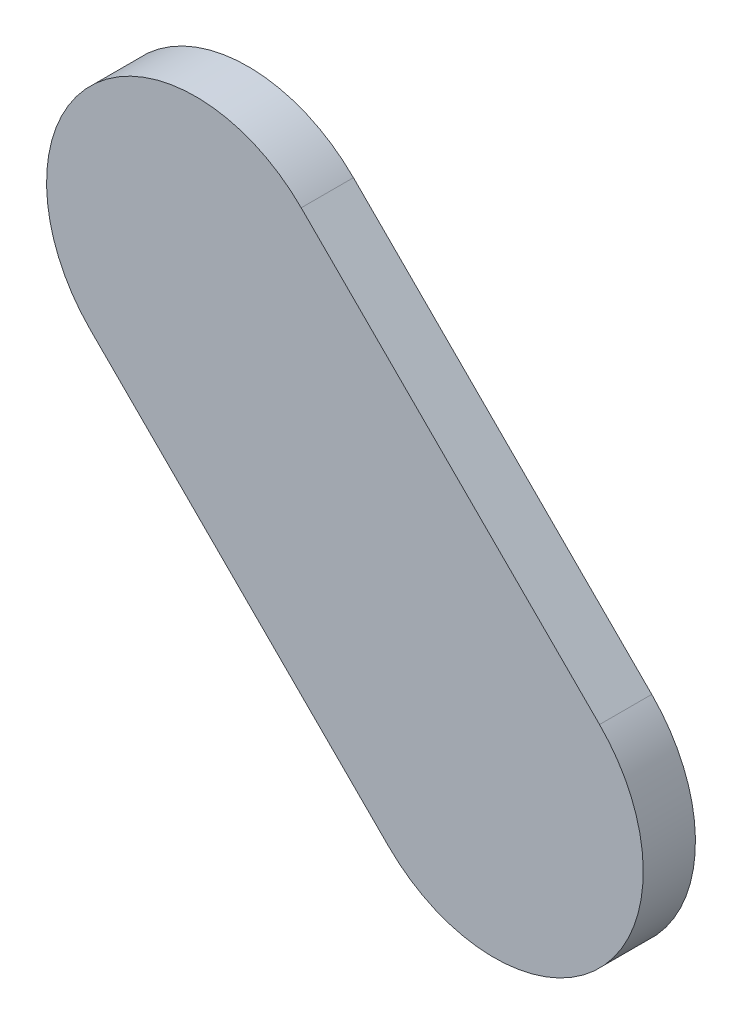
ISO-10303-21;
HEADER;
FILE_DESCRIPTION(('STEP AP214'),'2;1');
FILE_NAME('part.step','',(''),(''),'','','');
FILE_SCHEMA(('AUTOMOTIVE_DESIGN { 1 0 10303 214 1 1 1 1 }'));
ENDSEC;
DATA;
#1=APPLICATION_CONTEXT('core data for automotive mechanical design processes');
#2=APPLICATION_PROTOCOL_DEFINITION('international standard','automotive_design',2000,#1);
#3=PRODUCT_CONTEXT('',#1,'mechanical');
#4=PRODUCT('Part','Part','',(#3));
#5=PRODUCT_RELATED_PRODUCT_CATEGORY('part','',(#4));
#6=PRODUCT_DEFINITION_FORMATION('','',#4);
#7=PRODUCT_DEFINITION_CONTEXT('part definition',#1,'design');
#8=PRODUCT_DEFINITION('design','',#6,#7);
#9=PRODUCT_DEFINITION_SHAPE('','',#8);
#10=(LENGTH_UNIT() NAMED_UNIT(*) SI_UNIT(.MILLI.,.METRE.));
#11=(NAMED_UNIT(*) PLANE_ANGLE_UNIT() SI_UNIT($,.RADIAN.));
#12=(NAMED_UNIT(*) SI_UNIT($,.STERADIAN.) SOLID_ANGLE_UNIT());
#13=UNCERTAINTY_MEASURE_WITH_UNIT(LENGTH_MEASURE(1.E-05),#10,'distance_accuracy_value','');
#14=(GEOMETRIC_REPRESENTATION_CONTEXT(3) GLOBAL_UNCERTAINTY_ASSIGNED_CONTEXT((#13)) GLOBAL_UNIT_ASSIGNED_CONTEXT((#10,
#11,#12)) REPRESENTATION_CONTEXT('',''));
#15=CARTESIAN_POINT('',(0.,0.,0.));
#16=DIRECTION('',(0.,0.,1.));
#17=DIRECTION('',(1.,0.,0.));
#18=AXIS2_PLACEMENT_3D('',#15,#16,#17);
#19=CARTESIAN_POINT('',(85.854289,-112.47071,1.635));
#20=DIRECTION('',(0.,0.,1.));
#21=DIRECTION('',(1.,0.,0.));
#22=AXIS2_PLACEMENT_3D('',#19,#20,#21);
#23=PLANE('',#22);
#24=DIRECTION('',(0.707106781186548,-0.707106781186548,0.));
#25=VECTOR('',#24,1.);
#26=CARTESIAN_POINT('',(85.854289,-112.47071,1.635));
#27=LINE('',#26,#25);
#28=CARTESIAN_POINT('',(85.854289,-112.47071,1.635));
#29=VERTEX_POINT('',#28);
#30=CARTESIAN_POINT('',(86.054289,-112.67071,1.635));
#31=VERTEX_POINT('',#30);
#32=EDGE_CURVE('E99',#29,#31,#27,.T.);
#33=ORIENTED_EDGE('',*,*,#32,.T.);
#34=CARTESIAN_POINT('',(86.1249995,-112.5999995,1.635));
#35=DIRECTION('',(0.,0.,1.));
#36=DIRECTION('',(-0.707106781186548,-0.707106781186548,0.));
#37=AXIS2_PLACEMENT_3D('',#34,#35,#36);
#38=CIRCLE('',#37,0.09999974810219);
#39=CARTESIAN_POINT('',(86.19571,-112.529289,1.635));
#40=VERTEX_POINT('',#39);
#41=EDGE_CURVE('E80',#31,#40,#38,.T.);
#42=ORIENTED_EDGE('',*,*,#41,.T.);
#43=DIRECTION('',(-0.707106781186548,0.707106781186548,0.));
#44=VECTOR('',#43,1.);
#45=CARTESIAN_POINT('',(86.19571,-112.529289,1.635));
#46=LINE('',#45,#44);
#47=CARTESIAN_POINT('',(85.99571,-112.329289,1.635));
#48=VERTEX_POINT('',#47);
#49=EDGE_CURVE('E66',#40,#48,#46,.T.);
#50=ORIENTED_EDGE('',*,*,#49,.T.);
#51=CARTESIAN_POINT('',(85.9249995,-112.3999995,1.635));
#52=DIRECTION('',(0.,0.,1.));
#53=DIRECTION('',(0.707106781186548,0.707106781186548,0.));
#54=AXIS2_PLACEMENT_3D('',#51,#52,#53);
#55=CIRCLE('',#54,0.09999974810219);
#56=EDGE_CURVE('E11',#48,#29,#55,.T.);
#57=ORIENTED_EDGE('',*,*,#56,.T.);
#58=EDGE_LOOP('',(#33,#42,#50,#57));
#59=FACE_BOUND('',#58,.T.);
#60=ADVANCED_FACE('F17',(#59),#23,.T.);
#61=CARTESIAN_POINT('',(85.854289,-112.47071,1.6));
#62=DIRECTION('',(0.,0.,1.));
#63=DIRECTION('',(1.,0.,0.));
#64=AXIS2_PLACEMENT_3D('',#61,#62,#63);
#65=PLANE('',#64);
#66=CARTESIAN_POINT('',(85.9249995,-112.3999995,1.6));
#67=DIRECTION('',(0.,0.,1.));
#68=DIRECTION('',(0.707106781186548,0.707106781186548,0.));
#69=AXIS2_PLACEMENT_3D('',#66,#67,#68);
#70=CIRCLE('',#69,0.09999974810219);
#71=CARTESIAN_POINT('',(85.99571,-112.329289,1.6));
#72=VERTEX_POINT('',#71);
#73=CARTESIAN_POINT('',(85.854289,-112.47071,1.6));
#74=VERTEX_POINT('',#73);
#75=EDGE_CURVE('E21',#72,#74,#70,.T.);
#76=ORIENTED_EDGE('',*,*,#75,.F.);
#77=DIRECTION('',(-0.707106781186548,0.707106781186548,0.));
#78=VECTOR('',#77,1.);
#79=CARTESIAN_POINT('',(86.19571,-112.529289,1.6));
#80=LINE('',#79,#78);
#81=CARTESIAN_POINT('',(86.19571,-112.529289,1.6));
#82=VERTEX_POINT('',#81);
#83=EDGE_CURVE('E73',#82,#72,#80,.T.);
#84=ORIENTED_EDGE('',*,*,#83,.F.);
#85=CARTESIAN_POINT('',(86.1249995,-112.5999995,1.6));
#86=DIRECTION('',(0.,0.,1.));
#87=DIRECTION('',(-0.707106781186548,-0.707106781186548,0.));
#88=AXIS2_PLACEMENT_3D('',#85,#86,#87);
#89=CIRCLE('',#88,0.09999974810219);
#90=CARTESIAN_POINT('',(86.054289,-112.67071,1.6));
#91=VERTEX_POINT('',#90);
#92=EDGE_CURVE('E76',#91,#82,#89,.T.);
#93=ORIENTED_EDGE('',*,*,#92,.F.);
#94=DIRECTION('',(0.707106781186548,-0.707106781186548,0.));
#95=VECTOR('',#94,1.);
#96=CARTESIAN_POINT('',(85.854289,-112.47071,1.6));
#97=LINE('',#96,#95);
#98=EDGE_CURVE('E104',#74,#91,#97,.T.);
#99=ORIENTED_EDGE('',*,*,#98,.F.);
#100=EDGE_LOOP('',(#76,#84,#93,#99));
#101=FACE_BOUND('',#100,.T.);
#102=ADVANCED_FACE('F19',(#101),#65,.F.);
#103=CARTESIAN_POINT('',(85.9249995,-112.3999995,1.6));
#104=DIRECTION('',(0.,0.,-1.));
#105=DIRECTION('',(0.707106781186548,0.707106781186548,0.));
#106=AXIS2_PLACEMENT_3D('',#103,#104,#105);
#107=CYLINDRICAL_SURFACE('',#106,0.09999974810219);
#108=ORIENTED_EDGE('',*,*,#75,.T.);
#109=DIRECTION('',(0.,0.,1.));
#110=VECTOR('',#109,1.);
#111=CARTESIAN_POINT('',(85.854289,-112.47071,1.6));
#112=LINE('',#111,#110);
#113=EDGE_CURVE('E93',#74,#29,#112,.T.);
#114=ORIENTED_EDGE('',*,*,#113,.T.);
#115=ORIENTED_EDGE('',*,*,#56,.F.);
#116=DIRECTION('',(0.,0.,1.));
#117=VECTOR('',#116,1.);
#118=CARTESIAN_POINT('',(85.99571,-112.329289,1.6));
#119=LINE('',#118,#117);
#120=EDGE_CURVE('E79',#72,#48,#119,.T.);
#121=ORIENTED_EDGE('',*,*,#120,.F.);
#122=EDGE_LOOP('',(#108,#114,#115,#121));
#123=FACE_BOUND('',#122,.T.);
#124=ADVANCED_FACE('F121',(#123),#107,.T.);
#125=CARTESIAN_POINT('',(86.19571,-112.529289,1.6));
#126=DIRECTION('',(-0.707106781186548,-0.707106781186548,0.));
#127=DIRECTION('',(-0.707106781186548,0.707106781186548,0.));
#128=AXIS2_PLACEMENT_3D('',#125,#126,#127);
#129=PLANE('',#128);
#130=ORIENTED_EDGE('',*,*,#83,.T.);
#131=ORIENTED_EDGE('',*,*,#120,.T.);
#132=ORIENTED_EDGE('',*,*,#49,.F.);
#133=DIRECTION('',(0.,0.,1.));
#134=VECTOR('',#133,1.);
#135=CARTESIAN_POINT('',(86.19571,-112.529289,1.6));
#136=LINE('',#135,#134);
#137=EDGE_CURVE('E83',#82,#40,#136,.T.);
#138=ORIENTED_EDGE('',*,*,#137,.F.);
#139=EDGE_LOOP('',(#130,#131,#132,#138));
#140=FACE_BOUND('',#139,.T.);
#141=ADVANCED_FACE('F84',(#140),#129,.F.);
#142=CARTESIAN_POINT('',(86.1249995,-112.5999995,1.6));
#143=DIRECTION('',(0.,0.,-1.));
#144=DIRECTION('',(-0.707106781186548,-0.707106781186548,0.));
#145=AXIS2_PLACEMENT_3D('',#142,#143,#144);
#146=CYLINDRICAL_SURFACE('',#145,0.09999974810219);
#147=ORIENTED_EDGE('',*,*,#92,.T.);
#148=ORIENTED_EDGE('',*,*,#137,.T.);
#149=ORIENTED_EDGE('',*,*,#41,.F.);
#150=DIRECTION('',(0.,0.,1.));
#151=VECTOR('',#150,1.);
#152=CARTESIAN_POINT('',(86.054289,-112.67071,1.6));
#153=LINE('',#152,#151);
#154=EDGE_CURVE('E90',#91,#31,#153,.T.);
#155=ORIENTED_EDGE('',*,*,#154,.F.);
#156=EDGE_LOOP('',(#147,#148,#149,#155));
#157=FACE_BOUND('',#156,.T.);
#158=ADVANCED_FACE('F88',(#157),#146,.T.);
#159=CARTESIAN_POINT('',(85.854289,-112.47071,1.6));
#160=DIRECTION('',(0.707106781186548,0.707106781186548,0.));
#161=DIRECTION('',(0.,0.,-1.));
#162=AXIS2_PLACEMENT_3D('',#159,#160,#161);
#163=PLANE('',#162);
#164=ORIENTED_EDGE('',*,*,#98,.T.);
#165=ORIENTED_EDGE('',*,*,#154,.T.);
#166=ORIENTED_EDGE('',*,*,#32,.F.);
#167=ORIENTED_EDGE('',*,*,#113,.F.);
#168=EDGE_LOOP('',(#164,#165,#166,#167));
#169=FACE_BOUND('',#168,.T.);
#170=ADVANCED_FACE('F124',(#169),#163,.F.);
#171=CLOSED_SHELL('',(#60,#102,#124,#141,#158,#170));
#172=MANIFOLD_SOLID_BREP('B1',#171);
#173=ADVANCED_BREP_SHAPE_REPRESENTATION('',(#18,#172),#14);
#174=SHAPE_DEFINITION_REPRESENTATION(#9,#173);
ENDSEC;
END-ISO-10303-21;
